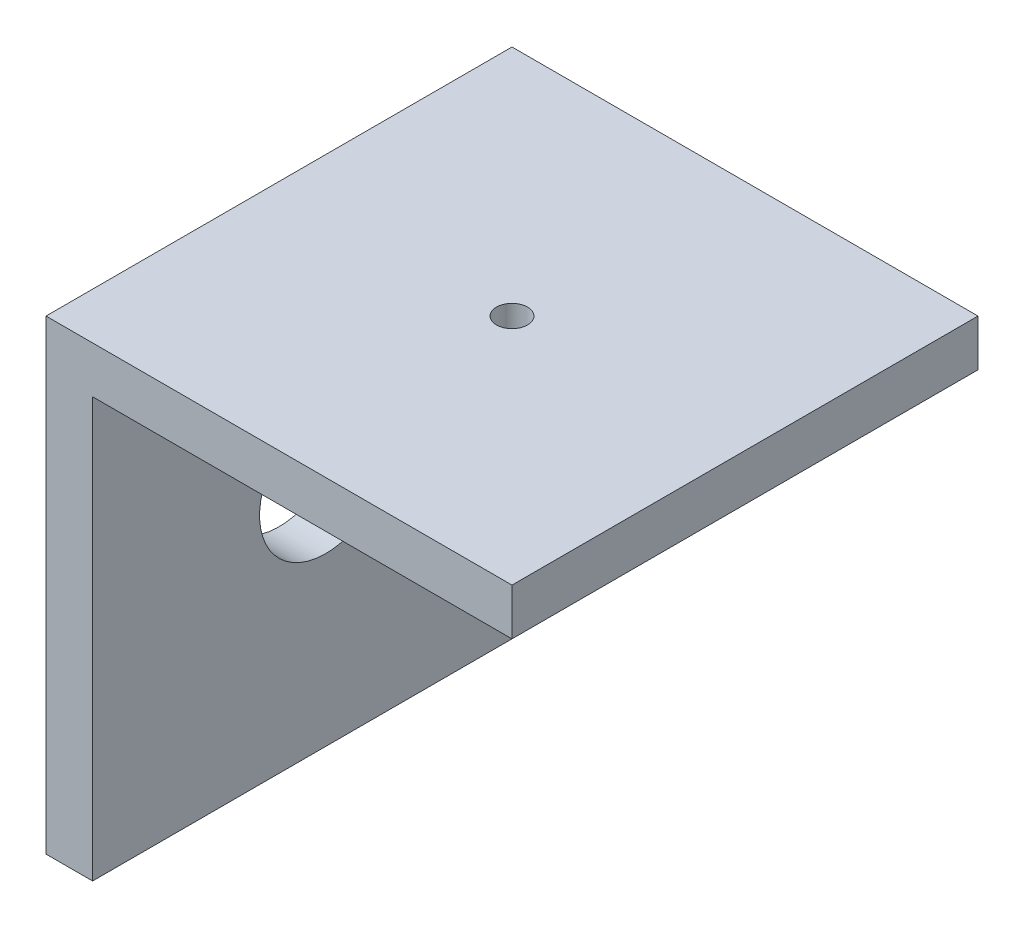
ISO-10303-21;
HEADER;
FILE_DESCRIPTION(('STEP AP214'),'2;1');
FILE_NAME('part.step','',(''),(''),'','','');
FILE_SCHEMA(('AUTOMOTIVE_DESIGN { 1 0 10303 214 1 1 1 1 }'));
ENDSEC;
DATA;
#1=APPLICATION_CONTEXT('core data for automotive mechanical design processes');
#2=APPLICATION_PROTOCOL_DEFINITION('international standard','automotive_design',2000,#1);
#3=PRODUCT_CONTEXT('',#1,'mechanical');
#4=PRODUCT('Part','Part','',(#3));
#5=PRODUCT_RELATED_PRODUCT_CATEGORY('part','',(#4));
#6=PRODUCT_DEFINITION_FORMATION('','',#4);
#7=PRODUCT_DEFINITION_CONTEXT('part definition',#1,'design');
#8=PRODUCT_DEFINITION('design','',#6,#7);
#9=PRODUCT_DEFINITION_SHAPE('','',#8);
#10=(LENGTH_UNIT() NAMED_UNIT(*) SI_UNIT(.MILLI.,.METRE.));
#11=(NAMED_UNIT(*) PLANE_ANGLE_UNIT() SI_UNIT($,.RADIAN.));
#12=(NAMED_UNIT(*) SI_UNIT($,.STERADIAN.) SOLID_ANGLE_UNIT());
#13=UNCERTAINTY_MEASURE_WITH_UNIT(LENGTH_MEASURE(1.E-05),#10,'distance_accuracy_value','');
#14=(GEOMETRIC_REPRESENTATION_CONTEXT(3) GLOBAL_UNCERTAINTY_ASSIGNED_CONTEXT((#13)) GLOBAL_UNIT_ASSIGNED_CONTEXT((#10,
#11,#12)) REPRESENTATION_CONTEXT('',''));
#15=CARTESIAN_POINT('',(0.,0.,0.));
#16=DIRECTION('',(0.,0.,1.));
#17=DIRECTION('',(1.,0.,0.));
#18=AXIS2_PLACEMENT_3D('',#15,#16,#17);
#19=CARTESIAN_POINT('',(3.,-30.,15.));
#20=DIRECTION('',(0.,1.,0.));
#21=DIRECTION('',(0.,0.,1.));
#22=AXIS2_PLACEMENT_3D('',#19,#20,#21);
#23=PLANE('',#22);
#24=DIRECTION('',(1.,0.,0.));
#25=VECTOR('',#24,1.);
#26=CARTESIAN_POINT('',(3.,-30.,-15.));
#27=LINE('',#26,#25);
#28=CARTESIAN_POINT('',(0.,-30.,-15.));
#29=VERTEX_POINT('',#28);
#30=CARTESIAN_POINT('',(3.,-30.,-15.));
#31=VERTEX_POINT('',#30);
#32=EDGE_CURVE('E118',#29,#31,#27,.T.);
#33=ORIENTED_EDGE('',*,*,#32,.T.);
#34=DIRECTION('',(0.,0.,-1.));
#35=VECTOR('',#34,1.);
#36=CARTESIAN_POINT('',(3.,-30.,15.));
#37=LINE('',#36,#35);
#38=CARTESIAN_POINT('',(3.,-30.,15.));
#39=VERTEX_POINT('',#38);
#40=EDGE_CURVE('E11',#39,#31,#37,.T.);
#41=ORIENTED_EDGE('',*,*,#40,.F.);
#42=DIRECTION('',(1.,0.,0.));
#43=VECTOR('',#42,1.);
#44=CARTESIAN_POINT('',(3.,-30.,15.));
#45=LINE('',#44,#43);
#46=CARTESIAN_POINT('',(0.,-30.,15.));
#47=VERTEX_POINT('',#46);
#48=EDGE_CURVE('E129',#47,#39,#45,.T.);
#49=ORIENTED_EDGE('',*,*,#48,.F.);
#50=DIRECTION('',(0.,0.,-1.));
#51=VECTOR('',#50,1.);
#52=CARTESIAN_POINT('',(0.,-30.,15.));
#53=LINE('',#52,#51);
#54=EDGE_CURVE('E114',#47,#29,#53,.T.);
#55=ORIENTED_EDGE('',*,*,#54,.T.);
#56=EDGE_LOOP('',(#33,#41,#49,#55));
#57=FACE_BOUND('',#56,.T.);
#58=ADVANCED_FACE('F34',(#57),#23,.F.);
#59=CARTESIAN_POINT('',(3.,-30.,15.));
#60=DIRECTION('',(-1.,0.,0.));
#61=DIRECTION('',(0.,0.,1.));
#62=AXIS2_PLACEMENT_3D('',#59,#60,#61);
#63=PLANE('',#62);
#64=CARTESIAN_POINT('',(3.,-15.,0.));
#65=DIRECTION('',(1.,0.,0.));
#66=DIRECTION('',(0.,0.,-1.));
#67=AXIS2_PLACEMENT_3D('',#64,#65,#66);
#68=CIRCLE('',#67,4.25);
#69=CARTESIAN_POINT('',(3.,-15.,-4.25));
#70=VERTEX_POINT('',#69);
#71=EDGE_CURVE('E235',#70,#70,#68,.T.);
#72=ORIENTED_EDGE('',*,*,#71,.F.);
#73=EDGE_LOOP('',(#72));
#74=FACE_BOUND('',#73,.T.);
#75=DIRECTION('',(0.,1.,0.));
#76=VECTOR('',#75,1.);
#77=CARTESIAN_POINT('',(3.,-30.,-15.));
#78=LINE('',#77,#76);
#79=CARTESIAN_POINT('',(3.,-3.,-15.));
#80=VERTEX_POINT('',#79);
#81=EDGE_CURVE('E121',#31,#80,#78,.T.);
#82=ORIENTED_EDGE('',*,*,#81,.T.);
#83=DIRECTION('',(0.,0.,-1.));
#84=VECTOR('',#83,1.);
#85=CARTESIAN_POINT('',(3.,-3.,15.));
#86=LINE('',#85,#84);
#87=CARTESIAN_POINT('',(3.,-3.,15.));
#88=VERTEX_POINT('',#87);
#89=EDGE_CURVE('E42',#88,#80,#86,.T.);
#90=ORIENTED_EDGE('',*,*,#89,.F.);
#91=DIRECTION('',(0.,1.,0.));
#92=VECTOR('',#91,1.);
#93=CARTESIAN_POINT('',(3.,-30.,15.));
#94=LINE('',#93,#92);
#95=EDGE_CURVE('E87',#39,#88,#94,.T.);
#96=ORIENTED_EDGE('',*,*,#95,.F.);
#97=ORIENTED_EDGE('',*,*,#40,.T.);
#98=EDGE_LOOP('',(#82,#90,#96,#97));
#99=FACE_BOUND('',#98,.T.);
#100=ADVANCED_FACE('F156',(#74,#99),#63,.F.);
#101=CARTESIAN_POINT('',(3.,-3.,15.));
#102=DIRECTION('',(0.,1.,0.));
#103=DIRECTION('',(0.,0.,1.));
#104=AXIS2_PLACEMENT_3D('',#101,#102,#103);
#105=PLANE('',#104);
#106=CARTESIAN_POINT('',(15.,-3.,0.));
#107=DIRECTION('',(0.,1.,0.));
#108=DIRECTION('',(0.,0.,1.));
#109=AXIS2_PLACEMENT_3D('',#106,#107,#108);
#110=CIRCLE('',#109,1.);
#111=CARTESIAN_POINT('',(15.,-3.,1.));
#112=VERTEX_POINT('',#111);
#113=EDGE_CURVE('E236',#112,#112,#110,.T.);
#114=ORIENTED_EDGE('',*,*,#113,.T.);
#115=EDGE_LOOP('',(#114));
#116=FACE_BOUND('',#115,.T.);
#117=DIRECTION('',(1.,0.,0.));
#118=VECTOR('',#117,1.);
#119=CARTESIAN_POINT('',(3.,-3.,-15.));
#120=LINE('',#119,#118);
#121=CARTESIAN_POINT('',(30.,-3.,-15.));
#122=VERTEX_POINT('',#121);
#123=EDGE_CURVE('E124',#80,#122,#120,.T.);
#124=ORIENTED_EDGE('',*,*,#123,.T.);
#125=DIRECTION('',(0.,0.,-1.));
#126=VECTOR('',#125,1.);
#127=CARTESIAN_POINT('',(30.,-3.,15.));
#128=LINE('',#127,#126);
#129=CARTESIAN_POINT('',(30.,-3.,15.));
#130=VERTEX_POINT('',#129);
#131=EDGE_CURVE('E109',#130,#122,#128,.T.);
#132=ORIENTED_EDGE('',*,*,#131,.F.);
#133=DIRECTION('',(1.,0.,0.));
#134=VECTOR('',#133,1.);
#135=CARTESIAN_POINT('',(3.,-3.,15.));
#136=LINE('',#135,#134);
#137=EDGE_CURVE('E100',#88,#130,#136,.T.);
#138=ORIENTED_EDGE('',*,*,#137,.F.);
#139=ORIENTED_EDGE('',*,*,#89,.T.);
#140=EDGE_LOOP('',(#124,#132,#138,#139));
#141=FACE_BOUND('',#140,.T.);
#142=ADVANCED_FACE('F135',(#116,#141),#105,.F.);
#143=CARTESIAN_POINT('',(30.,-3.,15.));
#144=DIRECTION('',(-1.,0.,0.));
#145=DIRECTION('',(0.,0.,1.));
#146=AXIS2_PLACEMENT_3D('',#143,#144,#145);
#147=PLANE('',#146);
#148=DIRECTION('',(0.,1.,0.));
#149=VECTOR('',#148,1.);
#150=CARTESIAN_POINT('',(30.,-3.,-15.));
#151=LINE('',#150,#149);
#152=CARTESIAN_POINT('',(30.,0.,-15.));
#153=VERTEX_POINT('',#152);
#154=EDGE_CURVE('E108',#122,#153,#151,.T.);
#155=ORIENTED_EDGE('',*,*,#154,.T.);
#156=DIRECTION('',(0.,0.,-1.));
#157=VECTOR('',#156,1.);
#158=CARTESIAN_POINT('',(30.,0.,15.));
#159=LINE('',#158,#157);
#160=CARTESIAN_POINT('',(30.,0.,15.));
#161=VERTEX_POINT('',#160);
#162=EDGE_CURVE('E105',#161,#153,#159,.T.);
#163=ORIENTED_EDGE('',*,*,#162,.F.);
#164=DIRECTION('',(0.,1.,0.));
#165=VECTOR('',#164,1.);
#166=CARTESIAN_POINT('',(30.,-3.,15.));
#167=LINE('',#166,#165);
#168=EDGE_CURVE('E94',#130,#161,#167,.T.);
#169=ORIENTED_EDGE('',*,*,#168,.F.);
#170=ORIENTED_EDGE('',*,*,#131,.T.);
#171=EDGE_LOOP('',(#155,#163,#169,#170));
#172=FACE_BOUND('',#171,.T.);
#173=ADVANCED_FACE('F106',(#172),#147,.F.);
#174=CARTESIAN_POINT('',(0.,0.,15.));
#175=DIRECTION('',(0.,-1.,0.));
#176=DIRECTION('',(0.,0.,-1.));
#177=AXIS2_PLACEMENT_3D('',#174,#175,#176);
#178=PLANE('',#177);
#179=CARTESIAN_POINT('',(15.,0.,0.));
#180=DIRECTION('',(0.,1.,0.));
#181=DIRECTION('',(0.,0.,1.));
#182=AXIS2_PLACEMENT_3D('',#179,#180,#181);
#183=CIRCLE('',#182,1.);
#184=CARTESIAN_POINT('',(15.,0.,1.));
#185=VERTEX_POINT('',#184);
#186=EDGE_CURVE('E240',#185,#185,#183,.T.);
#187=ORIENTED_EDGE('',*,*,#186,.F.);
#188=EDGE_LOOP('',(#187));
#189=FACE_BOUND('',#188,.T.);
#190=DIRECTION('',(-1.,0.,0.));
#191=VECTOR('',#190,1.);
#192=CARTESIAN_POINT('',(0.,0.,-15.));
#193=LINE('',#192,#191);
#194=CARTESIAN_POINT('',(0.,0.,-15.));
#195=VERTEX_POINT('',#194);
#196=EDGE_CURVE('E73',#153,#195,#193,.T.);
#197=ORIENTED_EDGE('',*,*,#196,.T.);
#198=DIRECTION('',(0.,0.,-1.));
#199=VECTOR('',#198,1.);
#200=CARTESIAN_POINT('',(0.,0.,15.));
#201=LINE('',#200,#199);
#202=CARTESIAN_POINT('',(0.,0.,15.));
#203=VERTEX_POINT('',#202);
#204=EDGE_CURVE('E110',#203,#195,#201,.T.);
#205=ORIENTED_EDGE('',*,*,#204,.F.);
#206=DIRECTION('',(-1.,0.,0.));
#207=VECTOR('',#206,1.);
#208=CARTESIAN_POINT('',(0.,0.,15.));
#209=LINE('',#208,#207);
#210=EDGE_CURVE('E98',#161,#203,#209,.T.);
#211=ORIENTED_EDGE('',*,*,#210,.F.);
#212=ORIENTED_EDGE('',*,*,#162,.T.);
#213=EDGE_LOOP('',(#197,#205,#211,#212));
#214=FACE_BOUND('',#213,.T.);
#215=ADVANCED_FACE('F112',(#189,#214),#178,.F.);
#216=CARTESIAN_POINT('',(0.,-30.,15.));
#217=DIRECTION('',(1.,0.,0.));
#218=DIRECTION('',(0.,0.,-1.));
#219=AXIS2_PLACEMENT_3D('',#216,#217,#218);
#220=PLANE('',#219);
#221=CARTESIAN_POINT('',(0.,-15.,0.));
#222=DIRECTION('',(1.,0.,0.));
#223=DIRECTION('',(0.,0.,-1.));
#224=AXIS2_PLACEMENT_3D('',#221,#222,#223);
#225=CIRCLE('',#224,4.25);
#226=CARTESIAN_POINT('',(0.,-15.,-4.25));
#227=VERTEX_POINT('',#226);
#228=EDGE_CURVE('E122',#227,#227,#225,.T.);
#229=ORIENTED_EDGE('',*,*,#228,.T.);
#230=EDGE_LOOP('',(#229));
#231=FACE_BOUND('',#230,.T.);
#232=DIRECTION('',(0.,-1.,0.));
#233=VECTOR('',#232,1.);
#234=CARTESIAN_POINT('',(0.,-30.,-15.));
#235=LINE('',#234,#233);
#236=EDGE_CURVE('E79',#195,#29,#235,.T.);
#237=ORIENTED_EDGE('',*,*,#236,.T.);
#238=ORIENTED_EDGE('',*,*,#54,.F.);
#239=DIRECTION('',(0.,-1.,0.));
#240=VECTOR('',#239,1.);
#241=CARTESIAN_POINT('',(0.,-30.,15.));
#242=LINE('',#241,#240);
#243=EDGE_CURVE('E50',#203,#47,#242,.T.);
#244=ORIENTED_EDGE('',*,*,#243,.F.);
#245=ORIENTED_EDGE('',*,*,#204,.T.);
#246=EDGE_LOOP('',(#237,#238,#244,#245));
#247=FACE_BOUND('',#246,.T.);
#248=ADVANCED_FACE('F142',(#231,#247),#220,.F.);
#249=CARTESIAN_POINT('',(0.,0.,15.));
#250=DIRECTION('',(0.,0.,-1.));
#251=DIRECTION('',(-1.,0.,0.));
#252=AXIS2_PLACEMENT_3D('',#249,#250,#251);
#253=PLANE('',#252);
#254=ORIENTED_EDGE('',*,*,#48,.T.);
#255=ORIENTED_EDGE('',*,*,#95,.T.);
#256=ORIENTED_EDGE('',*,*,#137,.T.);
#257=ORIENTED_EDGE('',*,*,#168,.T.);
#258=ORIENTED_EDGE('',*,*,#210,.T.);
#259=ORIENTED_EDGE('',*,*,#243,.T.);
#260=EDGE_LOOP('',(#254,#255,#256,#257,#258,#259));
#261=FACE_BOUND('',#260,.T.);
#262=ADVANCED_FACE('F96',(#261),#253,.F.);
#263=CARTESIAN_POINT('',(0.,0.,-15.));
#264=DIRECTION('',(0.,0.,-1.));
#265=DIRECTION('',(-1.,0.,0.));
#266=AXIS2_PLACEMENT_3D('',#263,#264,#265);
#267=PLANE('',#266);
#268=ORIENTED_EDGE('',*,*,#32,.F.);
#269=ORIENTED_EDGE('',*,*,#236,.F.);
#270=ORIENTED_EDGE('',*,*,#196,.F.);
#271=ORIENTED_EDGE('',*,*,#154,.F.);
#272=ORIENTED_EDGE('',*,*,#123,.F.);
#273=ORIENTED_EDGE('',*,*,#81,.F.);
#274=EDGE_LOOP('',(#268,#269,#270,#271,#272,#273));
#275=FACE_BOUND('',#274,.T.);
#276=ADVANCED_FACE('F138',(#275),#267,.T.);
#277=CARTESIAN_POINT('',(0.,-15.,0.));
#278=DIRECTION('',(1.,0.,0.));
#279=DIRECTION('',(0.,0.,-1.));
#280=AXIS2_PLACEMENT_3D('',#277,#278,#279);
#281=CYLINDRICAL_SURFACE('',#280,4.25);
#282=ORIENTED_EDGE('',*,*,#228,.F.);
#283=EDGE_LOOP('',(#282));
#284=FACE_BOUND('',#283,.T.);
#285=ORIENTED_EDGE('',*,*,#71,.T.);
#286=EDGE_LOOP('',(#285));
#287=FACE_BOUND('',#286,.T.);
#288=ADVANCED_FACE('F191',(#284,#287),#281,.F.);
#289=CARTESIAN_POINT('',(15.,-30.,0.));
#290=DIRECTION('',(0.,1.,0.));
#291=DIRECTION('',(0.,0.,1.));
#292=AXIS2_PLACEMENT_3D('',#289,#290,#291);
#293=CYLINDRICAL_SURFACE('',#292,1.);
#294=ORIENTED_EDGE('',*,*,#186,.T.);
#295=EDGE_LOOP('',(#294));
#296=FACE_BOUND('',#295,.T.);
#297=ORIENTED_EDGE('',*,*,#113,.F.);
#298=EDGE_LOOP('',(#297));
#299=FACE_BOUND('',#298,.T.);
#300=ADVANCED_FACE('F187',(#296,#299),#293,.F.);
#301=CLOSED_SHELL('',(#58,#100,#142,#173,#215,#248,#262,#276,#288,#300));
#302=MANIFOLD_SOLID_BREP('B2',#301);
#303=ADVANCED_BREP_SHAPE_REPRESENTATION('',(#18,#302),#14);
#304=SHAPE_DEFINITION_REPRESENTATION(#9,#303);
ENDSEC;
END-ISO-10303-21;
